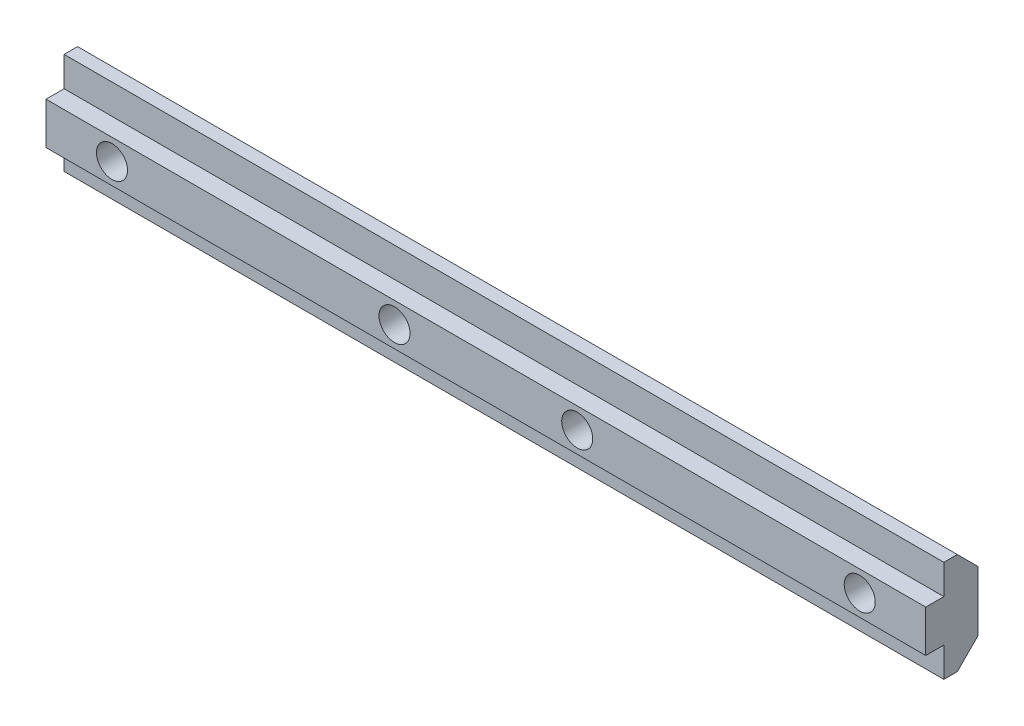
ISO-10303-21;
HEADER;
FILE_DESCRIPTION(('STEP AP214'),'2;1');
FILE_NAME('part.step','',(''),(''),'','','');
FILE_SCHEMA(('AUTOMOTIVE_DESIGN { 1 0 10303 214 1 1 1 1 }'));
ENDSEC;
DATA;
#1=APPLICATION_CONTEXT('core data for automotive mechanical design processes');
#2=APPLICATION_PROTOCOL_DEFINITION('international standard','automotive_design',2000,#1);
#3=PRODUCT_CONTEXT('',#1,'mechanical');
#4=PRODUCT('Part','Part','',(#3));
#5=PRODUCT_RELATED_PRODUCT_CATEGORY('part','',(#4));
#6=PRODUCT_DEFINITION_FORMATION('','',#4);
#7=PRODUCT_DEFINITION_CONTEXT('part definition',#1,'design');
#8=PRODUCT_DEFINITION('design','',#6,#7);
#9=PRODUCT_DEFINITION_SHAPE('','',#8);
#10=(LENGTH_UNIT() NAMED_UNIT(*) SI_UNIT(.MILLI.,.METRE.));
#11=(NAMED_UNIT(*) PLANE_ANGLE_UNIT() SI_UNIT($,.RADIAN.));
#12=(NAMED_UNIT(*) SI_UNIT($,.STERADIAN.) SOLID_ANGLE_UNIT());
#13=UNCERTAINTY_MEASURE_WITH_UNIT(LENGTH_MEASURE(1.E-05),#10,'distance_accuracy_value','');
#14=(GEOMETRIC_REPRESENTATION_CONTEXT(3) GLOBAL_UNCERTAINTY_ASSIGNED_CONTEXT((#13)) GLOBAL_UNIT_ASSIGNED_CONTEXT((#10,
#11,#12)) REPRESENTATION_CONTEXT('',''));
#15=CARTESIAN_POINT('',(0.,0.,0.));
#16=DIRECTION('',(0.,0.,1.));
#17=DIRECTION('',(1.,0.,0.));
#18=AXIS2_PLACEMENT_3D('',#15,#16,#17);
#19=CARTESIAN_POINT('',(85.,9.8,6.6));
#20=DIRECTION('',(0.,0.,-1.));
#21=DIRECTION('',(-1.,0.,0.));
#22=AXIS2_PLACEMENT_3D('',#19,#20,#21);
#23=PLANE('',#22);
#24=DIRECTION('',(1.,0.,0.));
#25=VECTOR('',#24,1.);
#26=CARTESIAN_POINT('',(-85.,-4.05,6.6));
#27=LINE('',#26,#25);
#28=CARTESIAN_POINT('',(-85.,-4.05,6.6));
#29=VERTEX_POINT('',#28);
#30=CARTESIAN_POINT('',(85.,-4.05,6.6));
#31=VERTEX_POINT('',#30);
#32=EDGE_CURVE('E130',#29,#31,#27,.T.);
#33=ORIENTED_EDGE('',*,*,#32,.F.);
#34=DIRECTION('',(0.,-1.,0.));
#35=VECTOR('',#34,1.);
#36=CARTESIAN_POINT('',(-85.,-9.8,6.6));
#37=LINE('',#36,#35);
#38=CARTESIAN_POINT('',(-85.,-9.8,6.6));
#39=VERTEX_POINT('',#38);
#40=EDGE_CURVE('E188',#29,#39,#37,.T.);
#41=ORIENTED_EDGE('',*,*,#40,.T.);
#42=DIRECTION('',(1.,0.,0.));
#43=VECTOR('',#42,1.);
#44=CARTESIAN_POINT('',(-85.,-9.8,6.6));
#45=LINE('',#44,#43);
#46=CARTESIAN_POINT('',(85.,-9.8,6.6));
#47=VERTEX_POINT('',#46);
#48=EDGE_CURVE('E182',#39,#47,#45,.T.);
#49=ORIENTED_EDGE('',*,*,#48,.T.);
#50=DIRECTION('',(0.,1.,0.));
#51=VECTOR('',#50,1.);
#52=CARTESIAN_POINT('',(85.,-9.8,6.6));
#53=LINE('',#52,#51);
#54=EDGE_CURVE('E168',#47,#31,#53,.T.);
#55=ORIENTED_EDGE('',*,*,#54,.T.);
#56=EDGE_LOOP('',(#33,#41,#49,#55));
#57=FACE_BOUND('',#56,.T.);
#58=ADVANCED_FACE('F31',(#57),#23,.F.);
#59=DIRECTION('',(-1.,0.,0.));
#60=VECTOR('',#59,1.);
#61=CARTESIAN_POINT('',(-85.,4.05,6.6));
#62=LINE('',#61,#60);
#63=CARTESIAN_POINT('',(85.,4.05,6.6));
#64=VERTEX_POINT('',#63);
#65=CARTESIAN_POINT('',(-85.,4.05,6.6));
#66=VERTEX_POINT('',#65);
#67=EDGE_CURVE('E152',#64,#66,#62,.T.);
#68=ORIENTED_EDGE('',*,*,#67,.F.);
#69=CARTESIAN_POINT('',(85.,9.8,6.6));
#70=VERTEX_POINT('',#69);
#71=EDGE_CURVE('E136',#64,#70,#53,.T.);
#72=ORIENTED_EDGE('',*,*,#71,.T.);
#73=DIRECTION('',(-1.,0.,0.));
#74=VECTOR('',#73,1.);
#75=CARTESIAN_POINT('',(-85.,9.8,6.6));
#76=LINE('',#75,#74);
#77=CARTESIAN_POINT('',(-85.,9.8,6.6));
#78=VERTEX_POINT('',#77);
#79=EDGE_CURVE('E162',#70,#78,#76,.T.);
#80=ORIENTED_EDGE('',*,*,#79,.T.);
#81=EDGE_CURVE('E184',#78,#66,#37,.T.);
#82=ORIENTED_EDGE('',*,*,#81,.T.);
#83=EDGE_LOOP('',(#68,#72,#80,#82));
#84=FACE_BOUND('',#83,.T.);
#85=ADVANCED_FACE('F197',(#84),#23,.F.);
#86=CARTESIAN_POINT('',(85.,-9.8,6.6));
#87=DIRECTION('',(-1.,0.,0.));
#88=DIRECTION('',(0.,0.,1.));
#89=AXIS2_PLACEMENT_3D('',#86,#87,#88);
#90=PLANE('',#89);
#91=DIRECTION('',(0.,0.,-1.));
#92=VECTOR('',#91,1.);
#93=CARTESIAN_POINT('',(85.,-9.8,6.6));
#94=LINE('',#93,#92);
#95=CARTESIAN_POINT('',(85.,-9.8,4.00000000000002));
#96=VERTEX_POINT('',#95);
#97=EDGE_CURVE('E180',#47,#96,#94,.T.);
#98=ORIENTED_EDGE('',*,*,#97,.T.);
#99=DIRECTION('',(0.,0.707106781186549,-0.707106781186546));
#100=VECTOR('',#99,1.);
#101=CARTESIAN_POINT('',(85.,-9.8,4.00000000000002));
#102=LINE('',#101,#100);
#103=CARTESIAN_POINT('',(85.,-5.79999999999997,0.));
#104=VERTEX_POINT('',#103);
#105=EDGE_CURVE('E295',#96,#104,#102,.T.);
#106=ORIENTED_EDGE('',*,*,#105,.T.);
#107=DIRECTION('',(0.,1.,0.));
#108=VECTOR('',#107,1.);
#109=CARTESIAN_POINT('',(85.,-9.8,0.));
#110=LINE('',#109,#108);
#111=CARTESIAN_POINT('',(85.,5.79999999999996,0.));
#112=VERTEX_POINT('',#111);
#113=EDGE_CURVE('E137',#104,#112,#110,.T.);
#114=ORIENTED_EDGE('',*,*,#113,.T.);
#115=DIRECTION('',(0.,0.707106781186549,0.707106781186546));
#116=VECTOR('',#115,1.);
#117=CARTESIAN_POINT('',(85.,9.8,4.00000000000002));
#118=LINE('',#117,#116);
#119=CARTESIAN_POINT('',(85.,9.8,4.00000000000002));
#120=VERTEX_POINT('',#119);
#121=EDGE_CURVE('E297',#112,#120,#118,.T.);
#122=ORIENTED_EDGE('',*,*,#121,.T.);
#123=DIRECTION('',(0.,0.,-1.));
#124=VECTOR('',#123,1.);
#125=CARTESIAN_POINT('',(85.,9.8,6.6));
#126=LINE('',#125,#124);
#127=EDGE_CURVE('E170',#70,#120,#126,.T.);
#128=ORIENTED_EDGE('',*,*,#127,.F.);
#129=ORIENTED_EDGE('',*,*,#71,.F.);
#130=DIRECTION('',(0.,0.,-1.));
#131=VECTOR('',#130,1.);
#132=CARTESIAN_POINT('',(85.,4.05,10.1));
#133=LINE('',#132,#131);
#134=CARTESIAN_POINT('',(85.,4.05,10.1));
#135=VERTEX_POINT('',#134);
#136=EDGE_CURVE('E115',#135,#64,#133,.T.);
#137=ORIENTED_EDGE('',*,*,#136,.F.);
#138=DIRECTION('',(0.,1.,0.));
#139=VECTOR('',#138,1.);
#140=CARTESIAN_POINT('',(85.,-4.05,10.1));
#141=LINE('',#140,#139);
#142=CARTESIAN_POINT('',(85.,-4.05,10.1));
#143=VERTEX_POINT('',#142);
#144=EDGE_CURVE('E121',#143,#135,#141,.T.);
#145=ORIENTED_EDGE('',*,*,#144,.F.);
#146=DIRECTION('',(0.,0.,-1.));
#147=VECTOR('',#146,1.);
#148=CARTESIAN_POINT('',(85.,-4.05,10.1));
#149=LINE('',#148,#147);
#150=EDGE_CURVE('E153',#143,#31,#149,.T.);
#151=ORIENTED_EDGE('',*,*,#150,.T.);
#152=ORIENTED_EDGE('',*,*,#54,.F.);
#153=EDGE_LOOP('',(#98,#106,#114,#122,#128,#129,#137,#145,#151,#152));
#154=FACE_BOUND('',#153,.T.);
#155=ADVANCED_FACE('F134',(#154),#90,.F.);
#156=CARTESIAN_POINT('',(-85.,9.8,6.6));
#157=DIRECTION('',(0.,-1.,0.));
#158=DIRECTION('',(0.,0.,-1.));
#159=AXIS2_PLACEMENT_3D('',#156,#157,#158);
#160=PLANE('',#159);
#161=ORIENTED_EDGE('',*,*,#127,.T.);
#162=DIRECTION('',(-1.,0.,0.));
#163=VECTOR('',#162,1.);
#164=CARTESIAN_POINT('',(-85.,9.8,4.00000000000002));
#165=LINE('',#164,#163);
#166=CARTESIAN_POINT('',(-85.,9.8,4.00000000000002));
#167=VERTEX_POINT('',#166);
#168=EDGE_CURVE('E11',#120,#167,#165,.T.);
#169=ORIENTED_EDGE('',*,*,#168,.T.);
#170=DIRECTION('',(0.,0.,-1.));
#171=VECTOR('',#170,1.);
#172=CARTESIAN_POINT('',(-85.,9.8,6.6));
#173=LINE('',#172,#171);
#174=EDGE_CURVE('E174',#78,#167,#173,.T.);
#175=ORIENTED_EDGE('',*,*,#174,.F.);
#176=ORIENTED_EDGE('',*,*,#79,.F.);
#177=EDGE_LOOP('',(#161,#169,#175,#176));
#178=FACE_BOUND('',#177,.T.);
#179=ADVANCED_FACE('F199',(#178),#160,.F.);
#180=CARTESIAN_POINT('',(-85.,-9.8,6.6));
#181=DIRECTION('',(1.,0.,0.));
#182=DIRECTION('',(0.,0.,-1.));
#183=AXIS2_PLACEMENT_3D('',#180,#181,#182);
#184=PLANE('',#183);
#185=DIRECTION('',(0.,-1.,0.));
#186=VECTOR('',#185,1.);
#187=CARTESIAN_POINT('',(-85.,-9.8,0.));
#188=LINE('',#187,#186);
#189=CARTESIAN_POINT('',(-85.,5.79999999999997,0.));
#190=VERTEX_POINT('',#189);
#191=CARTESIAN_POINT('',(-85.,-5.79999999999997,0.));
#192=VERTEX_POINT('',#191);
#193=EDGE_CURVE('E140',#190,#192,#188,.T.);
#194=ORIENTED_EDGE('',*,*,#193,.T.);
#195=DIRECTION('',(0.,-0.707106781186549,0.707106781186546));
#196=VECTOR('',#195,1.);
#197=CARTESIAN_POINT('',(-85.,-9.8,4.00000000000002));
#198=LINE('',#197,#196);
#199=CARTESIAN_POINT('',(-85.,-9.8,4.00000000000002));
#200=VERTEX_POINT('',#199);
#201=EDGE_CURVE('E39',#192,#200,#198,.T.);
#202=ORIENTED_EDGE('',*,*,#201,.T.);
#203=DIRECTION('',(0.,0.,-1.));
#204=VECTOR('',#203,1.);
#205=CARTESIAN_POINT('',(-85.,-9.8,6.6));
#206=LINE('',#205,#204);
#207=EDGE_CURVE('E177',#39,#200,#206,.T.);
#208=ORIENTED_EDGE('',*,*,#207,.F.);
#209=ORIENTED_EDGE('',*,*,#40,.F.);
#210=DIRECTION('',(0.,0.,-1.));
#211=VECTOR('',#210,1.);
#212=CARTESIAN_POINT('',(-85.,-4.05,10.1));
#213=LINE('',#212,#211);
#214=CARTESIAN_POINT('',(-85.,-4.05,10.1));
#215=VERTEX_POINT('',#214);
#216=EDGE_CURVE('E142',#215,#29,#213,.T.);
#217=ORIENTED_EDGE('',*,*,#216,.F.);
#218=DIRECTION('',(0.,-1.,0.));
#219=VECTOR('',#218,1.);
#220=CARTESIAN_POINT('',(-85.,-4.05,10.1));
#221=LINE('',#220,#219);
#222=CARTESIAN_POINT('',(-85.,4.05,10.1));
#223=VERTEX_POINT('',#222);
#224=EDGE_CURVE('E120',#223,#215,#221,.T.);
#225=ORIENTED_EDGE('',*,*,#224,.F.);
#226=DIRECTION('',(0.,0.,-1.));
#227=VECTOR('',#226,1.);
#228=CARTESIAN_POINT('',(-85.,4.05,10.1));
#229=LINE('',#228,#227);
#230=EDGE_CURVE('E117',#223,#66,#229,.T.);
#231=ORIENTED_EDGE('',*,*,#230,.T.);
#232=ORIENTED_EDGE('',*,*,#81,.F.);
#233=ORIENTED_EDGE('',*,*,#174,.T.);
#234=DIRECTION('',(0.,-0.707106781186549,-0.707106781186546));
#235=VECTOR('',#234,1.);
#236=CARTESIAN_POINT('',(-85.,9.8,4.00000000000002));
#237=LINE('',#236,#235);
#238=EDGE_CURVE('E46',#167,#190,#237,.T.);
#239=ORIENTED_EDGE('',*,*,#238,.T.);
#240=EDGE_LOOP('',(#194,#202,#208,#209,#217,#225,#231,#232,#233,#239));
#241=FACE_BOUND('',#240,.T.);
#242=ADVANCED_FACE('F201',(#241),#184,.F.);
#243=CARTESIAN_POINT('',(-85.,-9.8,6.6));
#244=DIRECTION('',(0.,1.,0.));
#245=DIRECTION('',(0.,0.,1.));
#246=AXIS2_PLACEMENT_3D('',#243,#244,#245);
#247=PLANE('',#246);
#248=ORIENTED_EDGE('',*,*,#207,.T.);
#249=DIRECTION('',(1.,0.,0.));
#250=VECTOR('',#249,1.);
#251=CARTESIAN_POINT('',(85.,-9.8,4.00000000000002));
#252=LINE('',#251,#250);
#253=EDGE_CURVE('E173',#200,#96,#252,.T.);
#254=ORIENTED_EDGE('',*,*,#253,.T.);
#255=ORIENTED_EDGE('',*,*,#97,.F.);
#256=ORIENTED_EDGE('',*,*,#48,.F.);
#257=EDGE_LOOP('',(#248,#254,#255,#256));
#258=FACE_BOUND('',#257,.T.);
#259=ADVANCED_FACE('F273',(#258),#247,.F.);
#260=CARTESIAN_POINT('',(85.,9.8,0.));
#261=DIRECTION('',(0.,0.,-1.));
#262=DIRECTION('',(-1.,0.,0.));
#263=AXIS2_PLACEMENT_3D('',#260,#261,#262);
#264=PLANE('',#263);
#265=CARTESIAN_POINT('',(72.2471148287565,4.95125989787797E-13,0.));
#266=DIRECTION('',(0.,0.,1.));
#267=DIRECTION('',(-1.,0.,0.));
#268=AXIS2_PLACEMENT_3D('',#265,#266,#267);
#269=CIRCLE('',#268,3.);
#270=CARTESIAN_POINT('',(69.2471148287565,4.95125989787797E-13,0.));
#271=VERTEX_POINT('',#270);
#272=EDGE_CURVE('E222',#271,#271,#269,.T.);
#273=ORIENTED_EDGE('',*,*,#272,.T.);
#274=EDGE_LOOP('',(#273));
#275=FACE_BOUND('',#274,.T.);
#276=CARTESIAN_POINT('',(17.6534340164767,1.20983017955515E-13,0.));
#277=DIRECTION('',(0.,0.,1.));
#278=DIRECTION('',(-1.,0.,0.));
#279=AXIS2_PLACEMENT_3D('',#276,#277,#278);
#280=CIRCLE('',#279,3.);
#281=CARTESIAN_POINT('',(14.6534340164767,1.20983017955515E-13,0.));
#282=VERTEX_POINT('',#281);
#283=EDGE_CURVE('E216',#282,#282,#280,.T.);
#284=ORIENTED_EDGE('',*,*,#283,.T.);
#285=EDGE_LOOP('',(#284));
#286=FACE_BOUND('',#285,.T.);
#287=CARTESIAN_POINT('',(-17.6534340164767,0.,0.));
#288=DIRECTION('',(0.,0.,1.));
#289=DIRECTION('',(1.,0.,0.));
#290=AXIS2_PLACEMENT_3D('',#287,#288,#289);
#291=CIRCLE('',#290,3.);
#292=CARTESIAN_POINT('',(-14.6534340164767,0.,0.));
#293=VERTEX_POINT('',#292);
#294=EDGE_CURVE('E210',#293,#293,#291,.T.);
#295=ORIENTED_EDGE('',*,*,#294,.T.);
#296=EDGE_LOOP('',(#295));
#297=FACE_BOUND('',#296,.T.);
#298=CARTESIAN_POINT('',(-72.2471148287565,0.,0.));
#299=DIRECTION('',(0.,0.,1.));
#300=DIRECTION('',(1.,0.,0.));
#301=AXIS2_PLACEMENT_3D('',#298,#299,#300);
#302=CIRCLE('',#301,3.00000000000001);
#303=CARTESIAN_POINT('',(-69.2471148287565,0.,0.));
#304=VERTEX_POINT('',#303);
#305=EDGE_CURVE('E209',#304,#304,#302,.T.);
#306=ORIENTED_EDGE('',*,*,#305,.T.);
#307=EDGE_LOOP('',(#306));
#308=FACE_BOUND('',#307,.T.);
#309=ORIENTED_EDGE('',*,*,#113,.F.);
#310=DIRECTION('',(-1.,0.,0.));
#311=VECTOR('',#310,1.);
#312=CARTESIAN_POINT('',(-85.,-5.79999999999997,0.));
#313=LINE('',#312,#311);
#314=EDGE_CURVE('E53',#104,#192,#313,.T.);
#315=ORIENTED_EDGE('',*,*,#314,.T.);
#316=ORIENTED_EDGE('',*,*,#193,.F.);
#317=DIRECTION('',(1.,0.,0.));
#318=VECTOR('',#317,1.);
#319=CARTESIAN_POINT('',(85.,5.79999999999997,0.));
#320=LINE('',#319,#318);
#321=EDGE_CURVE('E293',#190,#112,#320,.T.);
#322=ORIENTED_EDGE('',*,*,#321,.T.);
#323=EDGE_LOOP('',(#309,#315,#316,#322));
#324=FACE_BOUND('',#323,.T.);
#325=ADVANCED_FACE('F231',(#275,#286,#297,#308,#324),#264,.T.);
#326=CARTESIAN_POINT('',(-85.,4.05,10.1));
#327=DIRECTION('',(0.,-1.,0.));
#328=DIRECTION('',(0.,0.,-1.));
#329=AXIS2_PLACEMENT_3D('',#326,#327,#328);
#330=PLANE('',#329);
#331=ORIENTED_EDGE('',*,*,#67,.T.);
#332=ORIENTED_EDGE('',*,*,#230,.F.);
#333=DIRECTION('',(-1.,0.,0.));
#334=VECTOR('',#333,1.);
#335=CARTESIAN_POINT('',(-85.,4.05,10.1));
#336=LINE('',#335,#334);
#337=EDGE_CURVE('E110',#135,#223,#336,.T.);
#338=ORIENTED_EDGE('',*,*,#337,.F.);
#339=ORIENTED_EDGE('',*,*,#136,.T.);
#340=EDGE_LOOP('',(#331,#332,#338,#339));
#341=FACE_BOUND('',#340,.T.);
#342=ADVANCED_FACE('F113',(#341),#330,.F.);
#343=CARTESIAN_POINT('',(-85.,-4.05,10.1));
#344=DIRECTION('',(0.,1.,0.));
#345=DIRECTION('',(0.,0.,1.));
#346=AXIS2_PLACEMENT_3D('',#343,#344,#345);
#347=PLANE('',#346);
#348=ORIENTED_EDGE('',*,*,#32,.T.);
#349=ORIENTED_EDGE('',*,*,#150,.F.);
#350=DIRECTION('',(1.,0.,0.));
#351=VECTOR('',#350,1.);
#352=CARTESIAN_POINT('',(-85.,-4.05,10.1));
#353=LINE('',#352,#351);
#354=EDGE_CURVE('E126',#215,#143,#353,.T.);
#355=ORIENTED_EDGE('',*,*,#354,.F.);
#356=ORIENTED_EDGE('',*,*,#216,.T.);
#357=EDGE_LOOP('',(#348,#349,#355,#356));
#358=FACE_BOUND('',#357,.T.);
#359=ADVANCED_FACE('F245',(#358),#347,.F.);
#360=CARTESIAN_POINT('',(85.,4.05,10.1));
#361=DIRECTION('',(0.,0.,-1.));
#362=DIRECTION('',(-1.,0.,0.));
#363=AXIS2_PLACEMENT_3D('',#360,#361,#362);
#364=PLANE('',#363);
#365=CARTESIAN_POINT('',(72.2471148287565,4.95125989787797E-13,10.1));
#366=DIRECTION('',(0.,0.,1.));
#367=DIRECTION('',(-1.,0.,0.));
#368=AXIS2_PLACEMENT_3D('',#365,#366,#367);
#369=CIRCLE('',#368,3.);
#370=CARTESIAN_POINT('',(69.2471148287565,4.95125989787797E-13,10.1));
#371=VERTEX_POINT('',#370);
#372=EDGE_CURVE('E225',#371,#371,#369,.T.);
#373=ORIENTED_EDGE('',*,*,#372,.F.);
#374=EDGE_LOOP('',(#373));
#375=FACE_BOUND('',#374,.T.);
#376=CARTESIAN_POINT('',(17.6534340164767,1.20983017955515E-13,10.1));
#377=DIRECTION('',(0.,0.,1.));
#378=DIRECTION('',(-1.,0.,0.));
#379=AXIS2_PLACEMENT_3D('',#376,#377,#378);
#380=CIRCLE('',#379,3.);
#381=CARTESIAN_POINT('',(14.6534340164767,1.20983017955515E-13,10.1));
#382=VERTEX_POINT('',#381);
#383=EDGE_CURVE('E219',#382,#382,#380,.T.);
#384=ORIENTED_EDGE('',*,*,#383,.F.);
#385=EDGE_LOOP('',(#384));
#386=FACE_BOUND('',#385,.T.);
#387=CARTESIAN_POINT('',(-17.6534340164767,0.,10.1));
#388=DIRECTION('',(0.,0.,1.));
#389=DIRECTION('',(1.,0.,0.));
#390=AXIS2_PLACEMENT_3D('',#387,#388,#389);
#391=CIRCLE('',#390,3.);
#392=CARTESIAN_POINT('',(-14.6534340164767,0.,10.1));
#393=VERTEX_POINT('',#392);
#394=EDGE_CURVE('E213',#393,#393,#391,.T.);
#395=ORIENTED_EDGE('',*,*,#394,.F.);
#396=EDGE_LOOP('',(#395));
#397=FACE_BOUND('',#396,.T.);
#398=CARTESIAN_POINT('',(-72.2471148287565,0.,10.1));
#399=DIRECTION('',(0.,0.,1.));
#400=DIRECTION('',(1.,0.,0.));
#401=AXIS2_PLACEMENT_3D('',#398,#399,#400);
#402=CIRCLE('',#401,3.00000000000001);
#403=CARTESIAN_POINT('',(-69.2471148287565,0.,10.1));
#404=VERTEX_POINT('',#403);
#405=EDGE_CURVE('E206',#404,#404,#402,.T.);
#406=ORIENTED_EDGE('',*,*,#405,.F.);
#407=EDGE_LOOP('',(#406));
#408=FACE_BOUND('',#407,.T.);
#409=ORIENTED_EDGE('',*,*,#144,.T.);
#410=ORIENTED_EDGE('',*,*,#337,.T.);
#411=ORIENTED_EDGE('',*,*,#224,.T.);
#412=ORIENTED_EDGE('',*,*,#354,.T.);
#413=EDGE_LOOP('',(#409,#410,#411,#412));
#414=FACE_BOUND('',#413,.T.);
#415=ADVANCED_FACE('F124',(#375,#386,#397,#408,#414),#364,.F.);
#416=CARTESIAN_POINT('',(-72.2471148287565,0.,0.));
#417=DIRECTION('',(0.,0.,1.));
#418=DIRECTION('',(1.,0.,0.));
#419=AXIS2_PLACEMENT_3D('',#416,#417,#418);
#420=CYLINDRICAL_SURFACE('',#419,3.00000000000001);
#421=ORIENTED_EDGE('',*,*,#305,.F.);
#422=EDGE_LOOP('',(#421));
#423=FACE_BOUND('',#422,.T.);
#424=ORIENTED_EDGE('',*,*,#405,.T.);
#425=EDGE_LOOP('',(#424));
#426=FACE_BOUND('',#425,.T.);
#427=ADVANCED_FACE('F244',(#423,#426),#420,.F.);
#428=CARTESIAN_POINT('',(-17.6534340164767,0.,0.));
#429=DIRECTION('',(0.,0.,1.));
#430=DIRECTION('',(1.,0.,0.));
#431=AXIS2_PLACEMENT_3D('',#428,#429,#430);
#432=CYLINDRICAL_SURFACE('',#431,3.);
#433=ORIENTED_EDGE('',*,*,#294,.F.);
#434=EDGE_LOOP('',(#433));
#435=FACE_BOUND('',#434,.T.);
#436=ORIENTED_EDGE('',*,*,#394,.T.);
#437=EDGE_LOOP('',(#436));
#438=FACE_BOUND('',#437,.T.);
#439=ADVANCED_FACE('F254',(#435,#438),#432,.F.);
#440=CARTESIAN_POINT('',(17.6534340164767,1.20983017955515E-13,0.));
#441=DIRECTION('',(0.,0.,1.));
#442=DIRECTION('',(1.,0.,0.));
#443=AXIS2_PLACEMENT_3D('',#440,#441,#442);
#444=CYLINDRICAL_SURFACE('',#443,3.);
#445=ORIENTED_EDGE('',*,*,#283,.F.);
#446=EDGE_LOOP('',(#445));
#447=FACE_BOUND('',#446,.T.);
#448=ORIENTED_EDGE('',*,*,#383,.T.);
#449=EDGE_LOOP('',(#448));
#450=FACE_BOUND('',#449,.T.);
#451=ADVANCED_FACE('F238',(#447,#450),#444,.F.);
#452=CARTESIAN_POINT('',(72.2471148287565,4.95125989787797E-13,0.));
#453=DIRECTION('',(0.,0.,1.));
#454=DIRECTION('',(1.,0.,0.));
#455=AXIS2_PLACEMENT_3D('',#452,#453,#454);
#456=CYLINDRICAL_SURFACE('',#455,3.);
#457=ORIENTED_EDGE('',*,*,#272,.F.);
#458=EDGE_LOOP('',(#457));
#459=FACE_BOUND('',#458,.T.);
#460=ORIENTED_EDGE('',*,*,#372,.T.);
#461=EDGE_LOOP('',(#460));
#462=FACE_BOUND('',#461,.T.);
#463=ADVANCED_FACE('F234',(#459,#462),#456,.F.);
#464=CARTESIAN_POINT('',(-85.,-9.8,4.00000000000002));
#465=DIRECTION('',(0.,-0.707106781186546,-0.707106781186549));
#466=DIRECTION('',(0.,0.707106781186549,-0.707106781186546));
#467=AXIS2_PLACEMENT_3D('',#464,#465,#466);
#468=PLANE('',#467);
#469=ORIENTED_EDGE('',*,*,#201,.F.);
#470=ORIENTED_EDGE('',*,*,#314,.F.);
#471=ORIENTED_EDGE('',*,*,#105,.F.);
#472=ORIENTED_EDGE('',*,*,#253,.F.);
#473=EDGE_LOOP('',(#469,#470,#471,#472));
#474=FACE_BOUND('',#473,.T.);
#475=ADVANCED_FACE('F237',(#474),#468,.T.);
#476=CARTESIAN_POINT('',(-85.,9.8,4.00000000000002));
#477=DIRECTION('',(0.,0.707106781186546,-0.707106781186549));
#478=DIRECTION('',(0.,0.707106781186549,0.707106781186546));
#479=AXIS2_PLACEMENT_3D('',#476,#477,#478);
#480=PLANE('',#479);
#481=ORIENTED_EDGE('',*,*,#121,.F.);
#482=ORIENTED_EDGE('',*,*,#321,.F.);
#483=ORIENTED_EDGE('',*,*,#238,.F.);
#484=ORIENTED_EDGE('',*,*,#168,.F.);
#485=EDGE_LOOP('',(#481,#482,#483,#484));
#486=FACE_BOUND('',#485,.T.);
#487=ADVANCED_FACE('F33',(#486),#480,.T.);
#488=CLOSED_SHELL('',(#58,#85,#155,#179,#242,#259,#325,#342,#359,#415,#427,#439,#451,#463,#475,#487));
#489=MANIFOLD_SOLID_BREP('B2',#488);
#490=ADVANCED_BREP_SHAPE_REPRESENTATION('',(#18,#489),#14);
#491=SHAPE_DEFINITION_REPRESENTATION(#9,#490);
ENDSEC;
END-ISO-10303-21;
